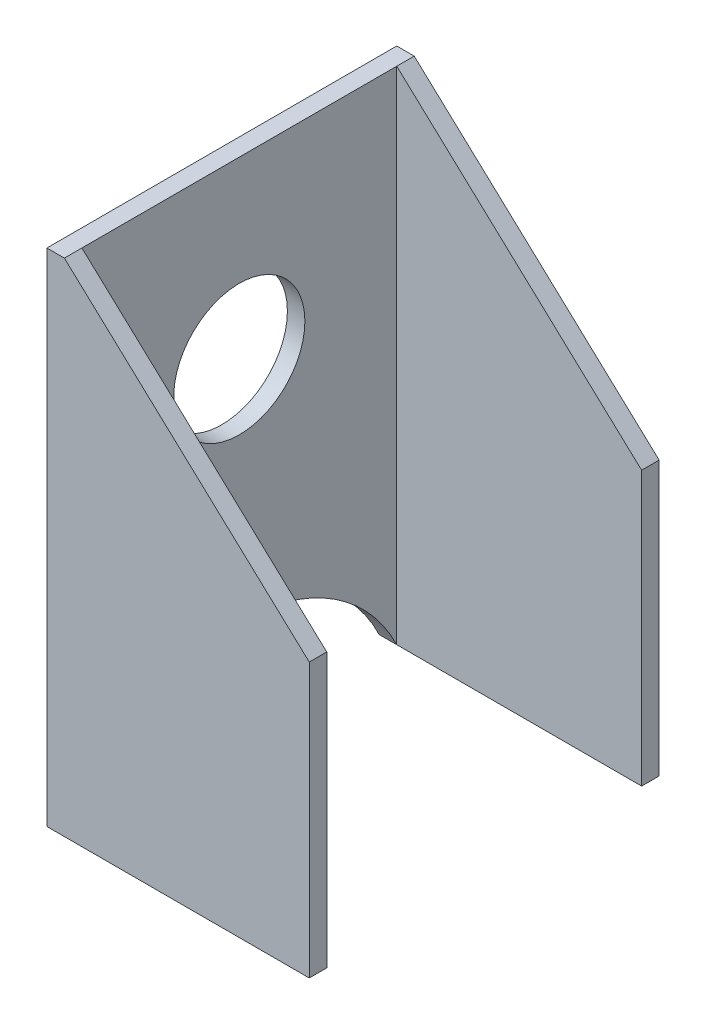
ISO-10303-21;
HEADER;
FILE_DESCRIPTION(('STEP AP214'),'2;1');
FILE_NAME('part.step','',(''),(''),'','','');
FILE_SCHEMA(('AUTOMOTIVE_DESIGN { 1 0 10303 214 1 1 1 1 }'));
ENDSEC;
DATA;
#1=APPLICATION_CONTEXT('core data for automotive mechanical design processes');
#2=APPLICATION_PROTOCOL_DEFINITION('international standard','automotive_design',2000,#1);
#3=PRODUCT_CONTEXT('',#1,'mechanical');
#4=PRODUCT('Part','Part','',(#3));
#5=PRODUCT_RELATED_PRODUCT_CATEGORY('part','',(#4));
#6=PRODUCT_DEFINITION_FORMATION('','',#4);
#7=PRODUCT_DEFINITION_CONTEXT('part definition',#1,'design');
#8=PRODUCT_DEFINITION('design','',#6,#7);
#9=PRODUCT_DEFINITION_SHAPE('','',#8);
#10=(LENGTH_UNIT() NAMED_UNIT(*) SI_UNIT(.MILLI.,.METRE.));
#11=(NAMED_UNIT(*) PLANE_ANGLE_UNIT() SI_UNIT($,.RADIAN.));
#12=(NAMED_UNIT(*) SI_UNIT($,.STERADIAN.) SOLID_ANGLE_UNIT());
#13=UNCERTAINTY_MEASURE_WITH_UNIT(LENGTH_MEASURE(1.E-05),#10,'distance_accuracy_value','');
#14=(GEOMETRIC_REPRESENTATION_CONTEXT(3) GLOBAL_UNCERTAINTY_ASSIGNED_CONTEXT((#13)) GLOBAL_UNIT_ASSIGNED_CONTEXT((#10,
#11,#12)) REPRESENTATION_CONTEXT('',''));
#15=CARTESIAN_POINT('',(0.,0.,0.));
#16=DIRECTION('',(0.,0.,1.));
#17=DIRECTION('',(1.,0.,0.));
#18=AXIS2_PLACEMENT_3D('',#15,#16,#17);
#19=CARTESIAN_POINT('',(1.27,-20.955,0.));
#20=DIRECTION('',(-1.,0.,0.));
#21=DIRECTION('',(0.,0.,1.));
#22=AXIS2_PLACEMENT_3D('',#19,#20,#21);
#23=CYLINDRICAL_SURFACE('',#22,12.7);
#24=CARTESIAN_POINT('',(0.,-20.955,0.));
#25=DIRECTION('',(1.,0.,0.));
#26=DIRECTION('',(0.,0.,-1.));
#27=AXIS2_PLACEMENT_3D('',#24,#25,#26);
#28=CIRCLE('',#27,12.7);
#29=CARTESIAN_POINT('',(0.,-15.4191983417034,-11.43));
#30=VERTEX_POINT('',#29);
#31=CARTESIAN_POINT('',(0.,-15.4191983417033,11.43));
#32=VERTEX_POINT('',#31);
#33=EDGE_CURVE('E165',#30,#32,#28,.T.);
#34=ORIENTED_EDGE('',*,*,#33,.F.);
#35=DIRECTION('',(-1.,0.,0.));
#36=VECTOR('',#35,1.);
#37=CARTESIAN_POINT('',(1.27,-15.4191983417034,-11.43));
#38=LINE('',#37,#36);
#39=CARTESIAN_POINT('',(1.27000000000001,-15.4191983417034,-11.43));
#40=VERTEX_POINT('',#39);
#41=EDGE_CURVE('E50',#40,#30,#38,.T.);
#42=ORIENTED_EDGE('',*,*,#41,.F.);
#43=CARTESIAN_POINT('',(1.27,-20.955,0.));
#44=DIRECTION('',(1.,0.,0.));
#45=DIRECTION('',(0.,0.,-1.));
#46=AXIS2_PLACEMENT_3D('',#43,#44,#45);
#47=CIRCLE('',#46,12.7);
#48=CARTESIAN_POINT('',(1.27,-15.4191983417033,11.43));
#49=VERTEX_POINT('',#48);
#50=EDGE_CURVE('E151',#40,#49,#47,.T.);
#51=ORIENTED_EDGE('',*,*,#50,.T.);
#52=DIRECTION('',(-1.,0.,0.));
#53=VECTOR('',#52,1.);
#54=CARTESIAN_POINT('',(1.27,-15.4191983417033,11.43));
#55=LINE('',#54,#53);
#56=EDGE_CURVE('E162',#49,#32,#55,.T.);
#57=ORIENTED_EDGE('',*,*,#56,.T.);
#58=EDGE_LOOP('',(#34,#42,#51,#57));
#59=FACE_BOUND('',#58,.T.);
#60=ADVANCED_FACE('F42',(#59),#23,.F.);
#61=CARTESIAN_POINT('',(1.27,20.955,0.));
#62=DIRECTION('',(0.,1.,0.));
#63=DIRECTION('',(0.,0.,1.));
#64=AXIS2_PLACEMENT_3D('',#61,#62,#63);
#65=PLANE('',#64);
#66=DIRECTION('',(0.,0.,1.));
#67=VECTOR('',#66,1.);
#68=CARTESIAN_POINT('',(1.27,20.955,-20.32));
#69=LINE('',#68,#67);
#70=CARTESIAN_POINT('',(1.27,20.955,-12.7));
#71=VERTEX_POINT('',#70);
#72=CARTESIAN_POINT('',(1.27,20.955,-11.43));
#73=VERTEX_POINT('',#72);
#74=EDGE_CURVE('E124',#71,#73,#69,.T.);
#75=ORIENTED_EDGE('',*,*,#74,.F.);
#76=DIRECTION('',(-1.,0.,0.));
#77=VECTOR('',#76,1.);
#78=CARTESIAN_POINT('',(19.05,20.955,-12.7));
#79=LINE('',#78,#77);
#80=CARTESIAN_POINT('',(0.,20.955,-12.7));
#81=VERTEX_POINT('',#80);
#82=EDGE_CURVE('E197',#71,#81,#79,.T.);
#83=ORIENTED_EDGE('',*,*,#82,.T.);
#84=DIRECTION('',(0.,0.,-1.));
#85=VECTOR('',#84,1.);
#86=CARTESIAN_POINT('',(0.,20.955,0.));
#87=LINE('',#86,#85);
#88=CARTESIAN_POINT('',(0.,20.955,12.7));
#89=VERTEX_POINT('',#88);
#90=EDGE_CURVE('E138',#89,#81,#87,.T.);
#91=ORIENTED_EDGE('',*,*,#90,.F.);
#92=DIRECTION('',(-1.,0.,0.));
#93=VECTOR('',#92,1.);
#94=CARTESIAN_POINT('',(19.05,20.955,12.7));
#95=LINE('',#94,#93);
#96=CARTESIAN_POINT('',(1.27,20.955,12.7));
#97=VERTEX_POINT('',#96);
#98=EDGE_CURVE('E130',#97,#89,#95,.T.);
#99=ORIENTED_EDGE('',*,*,#98,.F.);
#100=CARTESIAN_POINT('',(1.27,20.955,11.43));
#101=VERTEX_POINT('',#100);
#102=EDGE_CURVE('E116',#101,#97,#69,.T.);
#103=ORIENTED_EDGE('',*,*,#102,.F.);
#104=DIRECTION('',(0.,0.,-1.));
#105=VECTOR('',#104,1.);
#106=CARTESIAN_POINT('',(1.27,20.955,0.));
#107=LINE('',#106,#105);
#108=EDGE_CURVE('E157',#101,#73,#107,.T.);
#109=ORIENTED_EDGE('',*,*,#108,.T.);
#110=EDGE_LOOP('',(#75,#83,#91,#99,#103,#109));
#111=FACE_BOUND('',#110,.T.);
#112=ADVANCED_FACE('F136',(#111),#65,.T.);
#113=CARTESIAN_POINT('',(1.27,8.25500000000001,0.));
#114=DIRECTION('',(-1.,0.,0.));
#115=DIRECTION('',(0.,0.,1.));
#116=AXIS2_PLACEMENT_3D('',#113,#114,#115);
#117=CYLINDRICAL_SURFACE('',#116,4.7625);
#118=CARTESIAN_POINT('',(1.27,8.25500000000001,0.));
#119=DIRECTION('',(1.,0.,0.));
#120=DIRECTION('',(0.,0.,-1.));
#121=AXIS2_PLACEMENT_3D('',#118,#119,#120);
#122=CIRCLE('',#121,4.7625);
#123=CARTESIAN_POINT('',(1.27,8.25500000000001,-4.7625));
#124=VERTEX_POINT('',#123);
#125=EDGE_CURVE('E148',#124,#124,#122,.T.);
#126=ORIENTED_EDGE('',*,*,#125,.T.);
#127=EDGE_LOOP('',(#126));
#128=FACE_BOUND('',#127,.T.);
#129=CARTESIAN_POINT('',(0.,8.25500000000001,0.));
#130=DIRECTION('',(1.,0.,0.));
#131=DIRECTION('',(0.,0.,-1.));
#132=AXIS2_PLACEMENT_3D('',#129,#130,#131);
#133=CIRCLE('',#132,4.7625);
#134=CARTESIAN_POINT('',(0.,8.25500000000001,-4.7625));
#135=VERTEX_POINT('',#134);
#136=EDGE_CURVE('E143',#135,#135,#133,.T.);
#137=ORIENTED_EDGE('',*,*,#136,.F.);
#138=EDGE_LOOP('',(#137));
#139=FACE_BOUND('',#138,.T.);
#140=ADVANCED_FACE('F44',(#128,#139),#117,.F.);
#141=CARTESIAN_POINT('',(1.27,0.,0.));
#142=DIRECTION('',(1.,0.,0.));
#143=DIRECTION('',(0.,0.,-1.));
#144=AXIS2_PLACEMENT_3D('',#141,#142,#143);
#145=PLANE('',#144);
#146=ORIENTED_EDGE('',*,*,#125,.F.);
#147=EDGE_LOOP('',(#146));
#148=FACE_BOUND('',#147,.T.);
#149=ORIENTED_EDGE('',*,*,#50,.F.);
#150=DIRECTION('',(0.,-1.,0.));
#151=VECTOR('',#150,1.);
#152=CARTESIAN_POINT('',(1.27,0.,-11.43));
#153=LINE('',#152,#151);
#154=EDGE_CURVE('E154',#73,#40,#153,.T.);
#155=ORIENTED_EDGE('',*,*,#154,.F.);
#156=ORIENTED_EDGE('',*,*,#108,.F.);
#157=DIRECTION('',(0.,-1.,0.));
#158=VECTOR('',#157,1.);
#159=CARTESIAN_POINT('',(1.27,0.,11.43));
#160=LINE('',#159,#158);
#161=EDGE_CURVE('E159',#101,#49,#160,.T.);
#162=ORIENTED_EDGE('',*,*,#161,.T.);
#163=EDGE_LOOP('',(#149,#155,#156,#162));
#164=FACE_BOUND('',#163,.T.);
#165=ADVANCED_FACE('F238',(#148,#164),#145,.T.);
#166=CARTESIAN_POINT('',(0.,0.,0.));
#167=DIRECTION('',(1.,0.,0.));
#168=DIRECTION('',(0.,0.,-1.));
#169=AXIS2_PLACEMENT_3D('',#166,#167,#168);
#170=PLANE('',#169);
#171=ORIENTED_EDGE('',*,*,#136,.T.);
#172=EDGE_LOOP('',(#171));
#173=FACE_BOUND('',#172,.T.);
#174=ORIENTED_EDGE('',*,*,#33,.T.);
#175=DIRECTION('',(0.,0.,1.));
#176=VECTOR('',#175,1.);
#177=CARTESIAN_POINT('',(0.,-15.4191983417033,0.));
#178=LINE('',#177,#176);
#179=CARTESIAN_POINT('',(0.,-15.4191983417033,12.7));
#180=VERTEX_POINT('',#179);
#181=EDGE_CURVE('E202',#32,#180,#178,.T.);
#182=ORIENTED_EDGE('',*,*,#181,.T.);
#183=DIRECTION('',(0.,1.,0.));
#184=VECTOR('',#183,1.);
#185=CARTESIAN_POINT('',(0.,0.,12.7));
#186=LINE('',#185,#184);
#187=EDGE_CURVE('E207',#180,#89,#186,.T.);
#188=ORIENTED_EDGE('',*,*,#187,.T.);
#189=ORIENTED_EDGE('',*,*,#90,.T.);
#190=DIRECTION('',(0.,1.,0.));
#191=VECTOR('',#190,1.);
#192=CARTESIAN_POINT('',(0.,0.,-12.7));
#193=LINE('',#192,#191);
#194=CARTESIAN_POINT('',(0.,-15.4191983417034,-12.7));
#195=VERTEX_POINT('',#194);
#196=EDGE_CURVE('E188',#195,#81,#193,.T.);
#197=ORIENTED_EDGE('',*,*,#196,.F.);
#198=DIRECTION('',(0.,0.,-1.));
#199=VECTOR('',#198,1.);
#200=CARTESIAN_POINT('',(0.,-15.4191983417034,0.));
#201=LINE('',#200,#199);
#202=EDGE_CURVE('E177',#30,#195,#201,.T.);
#203=ORIENTED_EDGE('',*,*,#202,.F.);
#204=EDGE_LOOP('',(#174,#182,#188,#189,#197,#203));
#205=FACE_BOUND('',#204,.T.);
#206=ADVANCED_FACE('F185',(#173,#205),#170,.F.);
#207=CARTESIAN_POINT('',(19.05,0.,11.43));
#208=DIRECTION('',(0.,0.,-1.));
#209=DIRECTION('',(0.,1.,0.));
#210=AXIS2_PLACEMENT_3D('',#207,#208,#209);
#211=PLANE('',#210);
#212=DIRECTION('',(-0.732793491626299,0.680451099367278,0.));
#213=VECTOR('',#212,1.);
#214=CARTESIAN_POINT('',(21.2664109589041,2.38690410958905,11.43));
#215=LINE('',#214,#213);
#216=CARTESIAN_POINT('',(19.05,4.44500000000001,11.43));
#217=VERTEX_POINT('',#216);
#218=EDGE_CURVE('E119',#217,#101,#215,.T.);
#219=ORIENTED_EDGE('',*,*,#218,.F.);
#220=DIRECTION('',(0.,-1.,0.));
#221=VECTOR('',#220,1.);
#222=CARTESIAN_POINT('',(19.05,0.,11.43));
#223=LINE('',#222,#221);
#224=CARTESIAN_POINT('',(19.05,-15.4191983417033,11.43));
#225=VERTEX_POINT('',#224);
#226=EDGE_CURVE('E206',#217,#225,#223,.T.);
#227=ORIENTED_EDGE('',*,*,#226,.T.);
#228=DIRECTION('',(-1.,0.,0.));
#229=VECTOR('',#228,1.);
#230=CARTESIAN_POINT('',(19.05,-15.4191983417033,11.43));
#231=LINE('',#230,#229);
#232=EDGE_CURVE('E140',#225,#49,#231,.T.);
#233=ORIENTED_EDGE('',*,*,#232,.T.);
#234=ORIENTED_EDGE('',*,*,#161,.F.);
#235=EDGE_LOOP('',(#219,#227,#233,#234));
#236=FACE_BOUND('',#235,.T.);
#237=ADVANCED_FACE('F259',(#236),#211,.T.);
#238=CARTESIAN_POINT('',(19.05,-15.4191983417033,0.));
#239=DIRECTION('',(0.,-1.,0.));
#240=DIRECTION('',(0.,0.,-1.));
#241=AXIS2_PLACEMENT_3D('',#238,#239,#240);
#242=PLANE('',#241);
#243=ORIENTED_EDGE('',*,*,#181,.F.);
#244=ORIENTED_EDGE('',*,*,#56,.F.);
#245=ORIENTED_EDGE('',*,*,#232,.F.);
#246=DIRECTION('',(0.,0.,1.));
#247=VECTOR('',#246,1.);
#248=CARTESIAN_POINT('',(19.05,-15.4191983417033,0.));
#249=LINE('',#248,#247);
#250=CARTESIAN_POINT('',(19.05,-15.4191983417033,12.7));
#251=VERTEX_POINT('',#250);
#252=EDGE_CURVE('E203',#225,#251,#249,.T.);
#253=ORIENTED_EDGE('',*,*,#252,.T.);
#254=DIRECTION('',(-1.,0.,0.));
#255=VECTOR('',#254,1.);
#256=CARTESIAN_POINT('',(19.05,-15.4191983417033,12.7));
#257=LINE('',#256,#255);
#258=EDGE_CURVE('E141',#251,#180,#257,.T.);
#259=ORIENTED_EDGE('',*,*,#258,.T.);
#260=EDGE_LOOP('',(#243,#244,#245,#253,#259));
#261=FACE_BOUND('',#260,.T.);
#262=ADVANCED_FACE('F213',(#261),#242,.T.);
#263=CARTESIAN_POINT('',(19.05,0.,12.7));
#264=DIRECTION('',(0.,0.,1.));
#265=DIRECTION('',(1.,0.,0.));
#266=AXIS2_PLACEMENT_3D('',#263,#264,#265);
#267=PLANE('',#266);
#268=DIRECTION('',(0.732793491626299,-0.680451099367278,0.));
#269=VECTOR('',#268,1.);
#270=CARTESIAN_POINT('',(1.27,20.955,12.7));
#271=LINE('',#270,#269);
#272=CARTESIAN_POINT('',(19.05,4.44500000000001,12.7));
#273=VERTEX_POINT('',#272);
#274=EDGE_CURVE('E57',#97,#273,#271,.T.);
#275=ORIENTED_EDGE('',*,*,#274,.F.);
#276=ORIENTED_EDGE('',*,*,#98,.T.);
#277=ORIENTED_EDGE('',*,*,#187,.F.);
#278=ORIENTED_EDGE('',*,*,#258,.F.);
#279=DIRECTION('',(0.,1.,0.));
#280=VECTOR('',#279,1.);
#281=CARTESIAN_POINT('',(19.05,0.,12.7));
#282=LINE('',#281,#280);
#283=EDGE_CURVE('E133',#251,#273,#282,.T.);
#284=ORIENTED_EDGE('',*,*,#283,.T.);
#285=EDGE_LOOP('',(#275,#276,#277,#278,#284));
#286=FACE_BOUND('',#285,.T.);
#287=ADVANCED_FACE('F128',(#286),#267,.T.);
#288=CARTESIAN_POINT('',(19.05,0.,0.));
#289=DIRECTION('',(1.,0.,0.));
#290=DIRECTION('',(0.,0.,-1.));
#291=AXIS2_PLACEMENT_3D('',#288,#289,#290);
#292=PLANE('',#291);
#293=DIRECTION('',(0.,0.,1.));
#294=VECTOR('',#293,1.);
#295=CARTESIAN_POINT('',(19.05,4.44500000000001,-20.32));
#296=LINE('',#295,#294);
#297=EDGE_CURVE('E218',#217,#273,#296,.T.);
#298=ORIENTED_EDGE('',*,*,#297,.T.);
#299=ORIENTED_EDGE('',*,*,#283,.F.);
#300=ORIENTED_EDGE('',*,*,#252,.F.);
#301=ORIENTED_EDGE('',*,*,#226,.F.);
#302=EDGE_LOOP('',(#298,#299,#300,#301));
#303=FACE_BOUND('',#302,.T.);
#304=ADVANCED_FACE('F217',(#303),#292,.T.);
#305=CARTESIAN_POINT('',(19.05,0.,-11.43));
#306=DIRECTION('',(0.,0.,-1.));
#307=DIRECTION('',(0.,1.,0.));
#308=AXIS2_PLACEMENT_3D('',#305,#306,#307);
#309=PLANE('',#308);
#310=DIRECTION('',(0.,-1.,0.));
#311=VECTOR('',#310,1.);
#312=CARTESIAN_POINT('',(19.05,0.,-11.43));
#313=LINE('',#312,#311);
#314=CARTESIAN_POINT('',(19.05,4.44500000000001,-11.43));
#315=VERTEX_POINT('',#314);
#316=CARTESIAN_POINT('',(19.05,-15.4191983417034,-11.43));
#317=VERTEX_POINT('',#316);
#318=EDGE_CURVE('E190',#315,#317,#313,.T.);
#319=ORIENTED_EDGE('',*,*,#318,.F.);
#320=DIRECTION('',(-0.732793491626299,0.680451099367278,0.));
#321=VECTOR('',#320,1.);
#322=CARTESIAN_POINT('',(21.2664109589041,2.38690410958905,-11.43));
#323=LINE('',#322,#321);
#324=EDGE_CURVE('E64',#315,#73,#323,.T.);
#325=ORIENTED_EDGE('',*,*,#324,.T.);
#326=ORIENTED_EDGE('',*,*,#154,.T.);
#327=DIRECTION('',(-1.,0.,0.));
#328=VECTOR('',#327,1.);
#329=CARTESIAN_POINT('',(19.05,-15.4191983417034,-11.43));
#330=LINE('',#329,#328);
#331=EDGE_CURVE('E181',#317,#40,#330,.T.);
#332=ORIENTED_EDGE('',*,*,#331,.F.);
#333=EDGE_LOOP('',(#319,#325,#326,#332));
#334=FACE_BOUND('',#333,.T.);
#335=ADVANCED_FACE('F240',(#334),#309,.F.);
#336=CARTESIAN_POINT('',(19.05,-15.4191983417034,0.));
#337=DIRECTION('',(0.,1.,0.));
#338=DIRECTION('',(0.,0.,1.));
#339=AXIS2_PLACEMENT_3D('',#336,#337,#338);
#340=PLANE('',#339);
#341=ORIENTED_EDGE('',*,*,#202,.T.);
#342=DIRECTION('',(-1.,0.,0.));
#343=VECTOR('',#342,1.);
#344=CARTESIAN_POINT('',(19.05,-15.4191983417034,-12.7));
#345=LINE('',#344,#343);
#346=CARTESIAN_POINT('',(19.05,-15.4191983417034,-12.7));
#347=VERTEX_POINT('',#346);
#348=EDGE_CURVE('E199',#347,#195,#345,.T.);
#349=ORIENTED_EDGE('',*,*,#348,.F.);
#350=DIRECTION('',(0.,0.,-1.));
#351=VECTOR('',#350,1.);
#352=CARTESIAN_POINT('',(19.05,-15.4191983417034,0.));
#353=LINE('',#352,#351);
#354=EDGE_CURVE('E225',#317,#347,#353,.T.);
#355=ORIENTED_EDGE('',*,*,#354,.F.);
#356=ORIENTED_EDGE('',*,*,#331,.T.);
#357=ORIENTED_EDGE('',*,*,#41,.T.);
#358=EDGE_LOOP('',(#341,#349,#355,#356,#357));
#359=FACE_BOUND('',#358,.T.);
#360=ADVANCED_FACE('F175',(#359),#340,.F.);
#361=CARTESIAN_POINT('',(19.05,0.,-12.7));
#362=DIRECTION('',(0.,0.,1.));
#363=DIRECTION('',(1.,0.,0.));
#364=AXIS2_PLACEMENT_3D('',#361,#362,#363);
#365=PLANE('',#364);
#366=ORIENTED_EDGE('',*,*,#82,.F.);
#367=DIRECTION('',(0.732793491626299,-0.680451099367278,0.));
#368=VECTOR('',#367,1.);
#369=CARTESIAN_POINT('',(21.2664109589041,2.38690410958905,-12.7));
#370=LINE('',#369,#368);
#371=CARTESIAN_POINT('',(19.05,4.44500000000001,-12.7));
#372=VERTEX_POINT('',#371);
#373=EDGE_CURVE('E219',#71,#372,#370,.T.);
#374=ORIENTED_EDGE('',*,*,#373,.T.);
#375=DIRECTION('',(0.,1.,0.));
#376=VECTOR('',#375,1.);
#377=CARTESIAN_POINT('',(19.05,0.,-12.7));
#378=LINE('',#377,#376);
#379=EDGE_CURVE('E194',#347,#372,#378,.T.);
#380=ORIENTED_EDGE('',*,*,#379,.F.);
#381=ORIENTED_EDGE('',*,*,#348,.T.);
#382=ORIENTED_EDGE('',*,*,#196,.T.);
#383=EDGE_LOOP('',(#366,#374,#380,#381,#382));
#384=FACE_BOUND('',#383,.T.);
#385=ADVANCED_FACE('F233',(#384),#365,.F.);
#386=CARTESIAN_POINT('',(19.05,0.,0.));
#387=DIRECTION('',(1.,0.,0.));
#388=DIRECTION('',(0.,0.,-1.));
#389=AXIS2_PLACEMENT_3D('',#386,#387,#388);
#390=PLANE('',#389);
#391=DIRECTION('',(0.,0.,-1.));
#392=VECTOR('',#391,1.);
#393=CARTESIAN_POINT('',(19.05,4.44500000000001,0.));
#394=LINE('',#393,#392);
#395=EDGE_CURVE('E11',#315,#372,#394,.T.);
#396=ORIENTED_EDGE('',*,*,#395,.F.);
#397=ORIENTED_EDGE('',*,*,#318,.T.);
#398=ORIENTED_EDGE('',*,*,#354,.T.);
#399=ORIENTED_EDGE('',*,*,#379,.T.);
#400=EDGE_LOOP('',(#396,#397,#398,#399));
#401=FACE_BOUND('',#400,.T.);
#402=ADVANCED_FACE('F229',(#401),#390,.T.);
#403=CARTESIAN_POINT('',(1.27,20.955,-20.32));
#404=DIRECTION('',(-0.680451099367278,-0.732793491626299,0.));
#405=DIRECTION('',(0.732793491626299,-0.680451099367278,0.));
#406=AXIS2_PLACEMENT_3D('',#403,#404,#405);
#407=PLANE('',#406);
#408=ORIENTED_EDGE('',*,*,#395,.T.);
#409=ORIENTED_EDGE('',*,*,#373,.F.);
#410=ORIENTED_EDGE('',*,*,#74,.T.);
#411=ORIENTED_EDGE('',*,*,#324,.F.);
#412=EDGE_LOOP('',(#408,#409,#410,#411));
#413=FACE_BOUND('',#412,.T.);
#414=ADVANCED_FACE('F234',(#413),#407,.F.);
#415=ORIENTED_EDGE('',*,*,#218,.T.);
#416=ORIENTED_EDGE('',*,*,#102,.T.);
#417=ORIENTED_EDGE('',*,*,#274,.T.);
#418=ORIENTED_EDGE('',*,*,#297,.F.);
#419=EDGE_LOOP('',(#415,#416,#417,#418));
#420=FACE_BOUND('',#419,.T.);
#421=ADVANCED_FACE('F117',(#420),#407,.F.);
#422=CLOSED_SHELL('',(#60,#112,#140,#165,#206,#237,#262,#287,#304,#335,#360,#385,#402,#414,#421));
#423=MANIFOLD_SOLID_BREP('B2',#422);
#424=ADVANCED_BREP_SHAPE_REPRESENTATION('',(#18,#423),#14);
#425=SHAPE_DEFINITION_REPRESENTATION(#9,#424);
ENDSEC;
END-ISO-10303-21;
